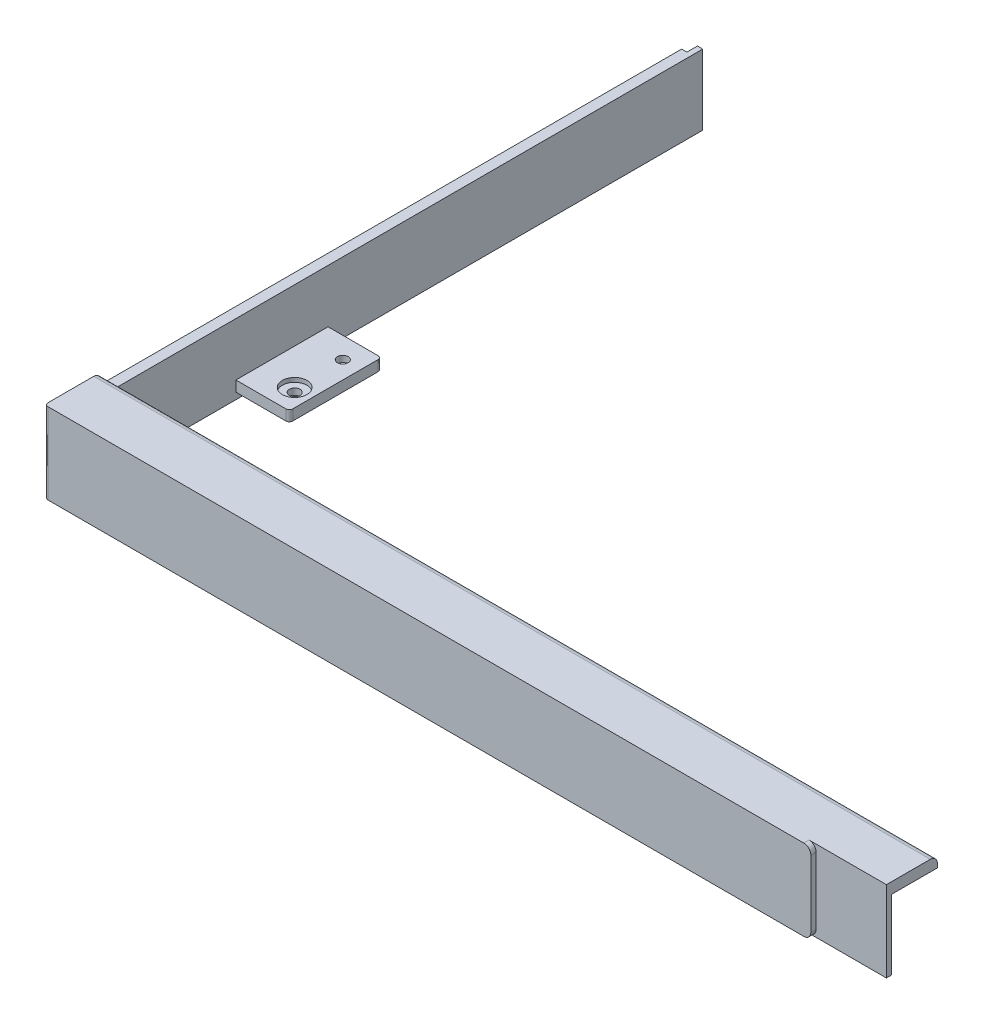
ISO-10303-21;
HEADER;
FILE_DESCRIPTION(('STEP AP214'),'2;1');
FILE_NAME('part.step','',(''),(''),'','','');
FILE_SCHEMA(('AUTOMOTIVE_DESIGN { 1 0 10303 214 1 1 1 1 }'));
ENDSEC;
DATA;
#1=APPLICATION_CONTEXT('core data for automotive mechanical design processes');
#2=APPLICATION_PROTOCOL_DEFINITION('international standard','automotive_design',2000,#1);
#3=PRODUCT_CONTEXT('',#1,'mechanical');
#4=PRODUCT('Part','Part','',(#3));
#5=PRODUCT_RELATED_PRODUCT_CATEGORY('part','',(#4));
#6=PRODUCT_DEFINITION_FORMATION('','',#4);
#7=PRODUCT_DEFINITION_CONTEXT('part definition',#1,'design');
#8=PRODUCT_DEFINITION('design','',#6,#7);
#9=PRODUCT_DEFINITION_SHAPE('','',#8);
#10=(LENGTH_UNIT() NAMED_UNIT(*) SI_UNIT(.MILLI.,.METRE.));
#11=(NAMED_UNIT(*) PLANE_ANGLE_UNIT() SI_UNIT($,.RADIAN.));
#12=(NAMED_UNIT(*) SI_UNIT($,.STERADIAN.) SOLID_ANGLE_UNIT());
#13=UNCERTAINTY_MEASURE_WITH_UNIT(LENGTH_MEASURE(1.E-05),#10,'distance_accuracy_value','');
#14=(GEOMETRIC_REPRESENTATION_CONTEXT(3) GLOBAL_UNCERTAINTY_ASSIGNED_CONTEXT((#13)) GLOBAL_UNIT_ASSIGNED_CONTEXT((#10,
#11,#12)) REPRESENTATION_CONTEXT('',''));
#15=CARTESIAN_POINT('',(0.,0.,0.));
#16=DIRECTION('',(0.,0.,1.));
#17=DIRECTION('',(1.,0.,0.));
#18=AXIS2_PLACEMENT_3D('',#15,#16,#17);
#19=CARTESIAN_POINT('',(-69.4,23.,-3.69999999999995));
#20=DIRECTION('',(-1.,0.,0.));
#21=DIRECTION('',(0.,0.,1.));
#22=AXIS2_PLACEMENT_3D('',#19,#20,#21);
#23=PLANE('',#22);
#24=DIRECTION('',(0.,1.,0.));
#25=VECTOR('',#24,1.);
#26=CARTESIAN_POINT('',(-69.4,0.,179.05));
#27=LINE('',#26,#25);
#28=CARTESIAN_POINT('',(-69.4,0.,179.05));
#29=VERTEX_POINT('',#28);
#30=CARTESIAN_POINT('',(-69.4,23.,179.05));
#31=VERTEX_POINT('',#30);
#32=EDGE_CURVE('E310',#29,#31,#27,.T.);
#33=ORIENTED_EDGE('',*,*,#32,.F.);
#34=DIRECTION('',(0.,0.,1.));
#35=VECTOR('',#34,1.);
#36=CARTESIAN_POINT('',(-69.4,0.,-3.69999999999995));
#37=LINE('',#36,#35);
#38=CARTESIAN_POINT('',(-69.4,0.,177.55));
#39=VERTEX_POINT('',#38);
#40=EDGE_CURVE('E336',#39,#29,#37,.T.);
#41=ORIENTED_EDGE('',*,*,#40,.F.);
#42=DIRECTION('',(0.,1.,0.));
#43=VECTOR('',#42,1.);
#44=CARTESIAN_POINT('',(-69.4,20.,177.55));
#45=LINE('',#44,#43);
#46=CARTESIAN_POINT('',(-69.4,19.8698079090092,177.55));
#47=VERTEX_POINT('',#46);
#48=EDGE_CURVE('E348',#39,#47,#45,.T.);
#49=ORIENTED_EDGE('',*,*,#48,.T.);
#50=DIRECTION('',(0.,0.,-1.));
#51=VECTOR('',#50,1.);
#52=CARTESIAN_POINT('',(-69.4,19.8698079090092,0.));
#53=LINE('',#52,#51);
#54=CARTESIAN_POINT('',(-69.4,19.8698079090092,164.55));
#55=VERTEX_POINT('',#54);
#56=EDGE_CURVE('E340',#47,#55,#53,.T.);
#57=ORIENTED_EDGE('',*,*,#56,.T.);
#58=DIRECTION('',(0.,1.,0.));
#59=VECTOR('',#58,1.);
#60=CARTESIAN_POINT('',(-69.4,19.8698079090092,164.55));
#61=LINE('',#60,#59);
#62=CARTESIAN_POINT('',(-69.4,21.,164.55));
#63=VERTEX_POINT('',#62);
#64=EDGE_CURVE('E335',#55,#63,#61,.T.);
#65=ORIENTED_EDGE('',*,*,#64,.T.);
#66=CARTESIAN_POINT('',(-69.4,21.,166.55));
#67=DIRECTION('',(-1.,0.,0.));
#68=DIRECTION('',(0.,0.,1.));
#69=AXIS2_PLACEMENT_3D('',#66,#67,#68);
#70=CIRCLE('',#69,2.);
#71=CARTESIAN_POINT('',(-69.4,23.,166.55));
#72=VERTEX_POINT('',#71);
#73=EDGE_CURVE('E333',#63,#72,#70,.F.);
#74=ORIENTED_EDGE('',*,*,#73,.T.);
#75=DIRECTION('',(0.,0.,1.));
#76=VECTOR('',#75,1.);
#77=CARTESIAN_POINT('',(-69.4,23.,-3.69999999999995));
#78=LINE('',#77,#76);
#79=EDGE_CURVE('E324',#72,#31,#78,.T.);
#80=ORIENTED_EDGE('',*,*,#79,.T.);
#81=EDGE_LOOP('',(#33,#41,#49,#57,#65,#74,#80));
#82=FACE_BOUND('',#81,.T.);
#83=ADVANCED_FACE('F155',(#82),#23,.F.);
#84=CARTESIAN_POINT('',(0.,23.,0.));
#85=DIRECTION('',(0.,-1.,0.));
#86=DIRECTION('',(0.,0.,-1.));
#87=AXIS2_PLACEMENT_3D('',#84,#85,#86);
#88=PLANE('',#87);
#89=DIRECTION('',(1.,0.,0.));
#90=VECTOR('',#89,1.);
#91=CARTESIAN_POINT('',(-307.4,23.,180.55));
#92=LINE('',#91,#90);
#93=CARTESIAN_POINT('',(-306.4,23.,180.55));
#94=VERTEX_POINT('',#93);
#95=CARTESIAN_POINT('',(-91.4,23.,180.55));
#96=VERTEX_POINT('',#95);
#97=EDGE_CURVE('E446',#94,#96,#92,.T.);
#98=ORIENTED_EDGE('',*,*,#97,.T.);
#99=DIRECTION('',(0.,0.,1.));
#100=VECTOR('',#99,1.);
#101=CARTESIAN_POINT('',(-91.4,23.,0.));
#102=LINE('',#101,#100);
#103=CARTESIAN_POINT('',(-91.4,23.,179.05));
#104=VERTEX_POINT('',#103);
#105=EDGE_CURVE('E327',#96,#104,#102,.F.);
#106=ORIENTED_EDGE('',*,*,#105,.T.);
#107=DIRECTION('',(-1.,0.,0.));
#108=VECTOR('',#107,1.);
#109=CARTESIAN_POINT('',(-69.4,23.,179.05));
#110=LINE('',#109,#108);
#111=EDGE_CURVE('E170',#31,#104,#110,.T.);
#112=ORIENTED_EDGE('',*,*,#111,.F.);
#113=ORIENTED_EDGE('',*,*,#79,.F.);
#114=DIRECTION('',(-1.,0.,0.));
#115=VECTOR('',#114,1.);
#116=CARTESIAN_POINT('',(-307.4,23.,166.55));
#117=LINE('',#116,#115);
#118=CARTESIAN_POINT('',(-307.4,23.,166.55));
#119=VERTEX_POINT('',#118);
#120=EDGE_CURVE('E500',#72,#119,#117,.T.);
#121=ORIENTED_EDGE('',*,*,#120,.T.);
#122=DIRECTION('',(0.,0.,1.));
#123=VECTOR('',#122,1.);
#124=CARTESIAN_POINT('',(-307.4,23.,180.55));
#125=LINE('',#124,#123);
#126=CARTESIAN_POINT('',(-307.4,23.,179.55));
#127=VERTEX_POINT('',#126);
#128=EDGE_CURVE('E442',#119,#127,#125,.T.);
#129=ORIENTED_EDGE('',*,*,#128,.T.);
#130=CARTESIAN_POINT('',(-306.4,23.,179.55));
#131=DIRECTION('',(0.,-1.,0.));
#132=DIRECTION('',(0.,0.,-1.));
#133=AXIS2_PLACEMENT_3D('',#130,#131,#132);
#134=CIRCLE('',#133,1.);
#135=EDGE_CURVE('E529',#127,#94,#134,.F.);
#136=ORIENTED_EDGE('',*,*,#135,.T.);
#137=EDGE_LOOP('',(#98,#106,#112,#113,#121,#129,#136));
#138=FACE_BOUND('',#137,.T.);
#139=ADVANCED_FACE('F323',(#138),#88,.F.);
#140=CARTESIAN_POINT('',(-294.2,1.86980790900918,122.6));
#141=DIRECTION('',(0.,1.,0.));
#142=DIRECTION('',(0.,0.,1.));
#143=AXIS2_PLACEMENT_3D('',#140,#141,#142);
#144=CYLINDRICAL_SURFACE('',#143,1.52499999999998);
#145=CARTESIAN_POINT('',(-294.2,1.86980790900918,122.6));
#146=DIRECTION('',(0.,1.,0.));
#147=DIRECTION('',(0.,0.,1.));
#148=AXIS2_PLACEMENT_3D('',#145,#146,#147);
#149=CIRCLE('',#148,1.52499999999998);
#150=CARTESIAN_POINT('',(-294.2,1.86980790900918,124.125));
#151=VERTEX_POINT('',#150);
#152=EDGE_CURVE('E431',#151,#151,#149,.T.);
#153=ORIENTED_EDGE('',*,*,#152,.F.);
#154=EDGE_LOOP('',(#153));
#155=FACE_BOUND('',#154,.T.);
#156=CARTESIAN_POINT('',(-294.2,3.66980790900918,122.6));
#157=DIRECTION('',(0.,1.,0.));
#158=DIRECTION('',(0.,0.,1.));
#159=AXIS2_PLACEMENT_3D('',#156,#157,#158);
#160=CIRCLE('',#159,1.52499999999998);
#161=CARTESIAN_POINT('',(-294.2,3.66980790900918,124.125));
#162=VERTEX_POINT('',#161);
#163=EDGE_CURVE('E376',#162,#162,#160,.F.);
#164=ORIENTED_EDGE('',*,*,#163,.F.);
#165=EDGE_LOOP('',(#164));
#166=FACE_BOUND('',#165,.T.);
#167=ADVANCED_FACE('F663',(#155,#166),#144,.F.);
#168=CARTESIAN_POINT('',(-294.2,1.86980790900918,108.900000000002));
#169=DIRECTION('',(0.,1.,0.));
#170=DIRECTION('',(0.,0.,1.));
#171=AXIS2_PLACEMENT_3D('',#168,#169,#170);
#172=CYLINDRICAL_SURFACE('',#171,1.52499999999999);
#173=CARTESIAN_POINT('',(-294.2,4.86980790900918,108.900000000002));
#174=DIRECTION('',(0.,1.,0.));
#175=DIRECTION('',(0.,0.,1.));
#176=AXIS2_PLACEMENT_3D('',#173,#174,#175);
#177=CIRCLE('',#176,1.52499999999999);
#178=CARTESIAN_POINT('',(-294.2,4.86980790900918,110.425000000002));
#179=VERTEX_POINT('',#178);
#180=EDGE_CURVE('E414',#179,#179,#177,.T.);
#181=ORIENTED_EDGE('',*,*,#180,.T.);
#182=EDGE_LOOP('',(#181));
#183=FACE_BOUND('',#182,.T.);
#184=CARTESIAN_POINT('',(-294.2,3.06980790900918,108.900000000002));
#185=DIRECTION('',(0.,-1.,0.));
#186=DIRECTION('',(0.,0.,-1.));
#187=AXIS2_PLACEMENT_3D('',#184,#185,#186);
#188=CIRCLE('',#187,1.52499999999999);
#189=CARTESIAN_POINT('',(-294.2,3.06980790900918,107.375000000002));
#190=VERTEX_POINT('',#189);
#191=EDGE_CURVE('E384',#190,#190,#188,.F.);
#192=ORIENTED_EDGE('',*,*,#191,.F.);
#193=EDGE_LOOP('',(#192));
#194=FACE_BOUND('',#193,.T.);
#195=ADVANCED_FACE('F706',(#183,#194),#172,.F.);
#196=CARTESIAN_POINT('',(0.,20.,0.));
#197=DIRECTION('',(0.,1.,0.));
#198=DIRECTION('',(0.,0.,1.));
#199=AXIS2_PLACEMENT_3D('',#196,#197,#198);
#200=PLANE('',#199);
#201=DIRECTION('',(1.,0.,0.));
#202=VECTOR('',#201,1.);
#203=CARTESIAN_POINT('',(0.,20.,-0.699999999999962));
#204=LINE('',#203,#202);
#205=CARTESIAN_POINT('',(-307.4,20.,-0.699999999999962));
#206=VERTEX_POINT('',#205);
#207=CARTESIAN_POINT('',(-305.9,20.,-0.699999999999962));
#208=VERTEX_POINT('',#207);
#209=EDGE_CURVE('E368',#206,#208,#204,.T.);
#210=ORIENTED_EDGE('',*,*,#209,.F.);
#211=DIRECTION('',(0.,0.,1.));
#212=VECTOR('',#211,1.);
#213=CARTESIAN_POINT('',(-307.4,20.,-3.69999999999994));
#214=LINE('',#213,#212);
#215=CARTESIAN_POINT('',(-307.4,20.,164.55));
#216=VERTEX_POINT('',#215);
#217=EDGE_CURVE('E486',#206,#216,#214,.T.);
#218=ORIENTED_EDGE('',*,*,#217,.T.);
#219=DIRECTION('',(-1.,0.,0.));
#220=VECTOR('',#219,1.);
#221=CARTESIAN_POINT('',(0.,20.,164.55));
#222=LINE('',#221,#220);
#223=CARTESIAN_POINT('',(-304.4,20.,164.55));
#224=VERTEX_POINT('',#223);
#225=EDGE_CURVE('E463',#224,#216,#222,.T.);
#226=ORIENTED_EDGE('',*,*,#225,.F.);
#227=DIRECTION('',(0.,0.,1.));
#228=VECTOR('',#227,1.);
#229=CARTESIAN_POINT('',(-304.4,20.,-3.69999999999994));
#230=LINE('',#229,#228);
#231=CARTESIAN_POINT('',(-304.4,20.,-3.69999999999994));
#232=VERTEX_POINT('',#231);
#233=EDGE_CURVE('E468',#232,#224,#230,.T.);
#234=ORIENTED_EDGE('',*,*,#233,.F.);
#235=DIRECTION('',(1.,0.,0.));
#236=VECTOR('',#235,1.);
#237=CARTESIAN_POINT('',(307.4,20.,-3.69999999999996));
#238=LINE('',#237,#236);
#239=CARTESIAN_POINT('',(-305.9,20.,-3.69999999999996));
#240=VERTEX_POINT('',#239);
#241=EDGE_CURVE('E439',#240,#232,#238,.T.);
#242=ORIENTED_EDGE('',*,*,#241,.F.);
#243=DIRECTION('',(0.,0.,-1.));
#244=VECTOR('',#243,1.);
#245=CARTESIAN_POINT('',(-305.9,20.,0.));
#246=LINE('',#245,#244);
#247=EDGE_CURVE('E363',#208,#240,#246,.T.);
#248=ORIENTED_EDGE('',*,*,#247,.F.);
#249=EDGE_LOOP('',(#210,#218,#226,#234,#242,#248));
#250=FACE_BOUND('',#249,.T.);
#251=ADVANCED_FACE('F607',(#250),#200,.T.);
#252=CARTESIAN_POINT('',(0.,0.,0.));
#253=DIRECTION('',(0.,1.,0.));
#254=DIRECTION('',(0.,0.,1.));
#255=AXIS2_PLACEMENT_3D('',#252,#253,#254);
#256=PLANE('',#255);
#257=DIRECTION('',(1.,0.,0.));
#258=VECTOR('',#257,1.);
#259=CARTESIAN_POINT('',(-69.4,0.,179.05));
#260=LINE('',#259,#258);
#261=CARTESIAN_POINT('',(-91.4,0.,179.05));
#262=VERTEX_POINT('',#261);
#263=EDGE_CURVE('E313',#262,#29,#260,.T.);
#264=ORIENTED_EDGE('',*,*,#263,.F.);
#265=DIRECTION('',(0.,0.,1.));
#266=VECTOR('',#265,1.);
#267=CARTESIAN_POINT('',(-91.4,0.,0.));
#268=LINE('',#267,#266);
#269=CARTESIAN_POINT('',(-91.4,0.,180.55));
#270=VERTEX_POINT('',#269);
#271=EDGE_CURVE('E560',#262,#270,#268,.T.);
#272=ORIENTED_EDGE('',*,*,#271,.T.);
#273=DIRECTION('',(1.,0.,0.));
#274=VECTOR('',#273,1.);
#275=CARTESIAN_POINT('',(-304.4,0.,180.55));
#276=LINE('',#275,#274);
#277=CARTESIAN_POINT('',(-306.4,0.,180.55));
#278=VERTEX_POINT('',#277);
#279=EDGE_CURVE('E490',#278,#270,#276,.T.);
#280=ORIENTED_EDGE('',*,*,#279,.F.);
#281=CARTESIAN_POINT('',(-306.4,0.,179.55));
#282=DIRECTION('',(0.,1.,0.));
#283=DIRECTION('',(0.,0.,1.));
#284=AXIS2_PLACEMENT_3D('',#281,#282,#283);
#285=CIRCLE('',#284,1.);
#286=CARTESIAN_POINT('',(-307.4,0.,179.55));
#287=VERTEX_POINT('',#286);
#288=EDGE_CURVE('E523',#278,#287,#285,.F.);
#289=ORIENTED_EDGE('',*,*,#288,.T.);
#290=DIRECTION('',(0.,0.,1.));
#291=VECTOR('',#290,1.);
#292=CARTESIAN_POINT('',(-307.4,0.,-3.69999999999994));
#293=LINE('',#292,#291);
#294=CARTESIAN_POINT('',(-307.4,0.,-0.699999999999962));
#295=VERTEX_POINT('',#294);
#296=EDGE_CURVE('E485',#295,#287,#293,.T.);
#297=ORIENTED_EDGE('',*,*,#296,.F.);
#298=DIRECTION('',(-1.,0.,0.));
#299=VECTOR('',#298,1.);
#300=CARTESIAN_POINT('',(-305.9,0.,-0.699999999999962));
#301=LINE('',#300,#299);
#302=CARTESIAN_POINT('',(-305.9,0.,-0.699999999999962));
#303=VERTEX_POINT('',#302);
#304=EDGE_CURVE('E355',#303,#295,#301,.T.);
#305=ORIENTED_EDGE('',*,*,#304,.F.);
#306=DIRECTION('',(0.,0.,1.));
#307=VECTOR('',#306,1.);
#308=CARTESIAN_POINT('',(-305.9,0.,-3.69999999999996));
#309=LINE('',#308,#307);
#310=CARTESIAN_POINT('',(-305.9,0.,-3.69999999999996));
#311=VERTEX_POINT('',#310);
#312=EDGE_CURVE('E351',#311,#303,#309,.T.);
#313=ORIENTED_EDGE('',*,*,#312,.F.);
#314=DIRECTION('',(-1.,0.,0.));
#315=VECTOR('',#314,1.);
#316=CARTESIAN_POINT('',(307.4,0.,-3.69999999999996));
#317=LINE('',#316,#315);
#318=CARTESIAN_POINT('',(-304.4,0.,-3.69999999999996));
#319=VERTEX_POINT('',#318);
#320=EDGE_CURVE('E435',#319,#311,#317,.T.);
#321=ORIENTED_EDGE('',*,*,#320,.F.);
#322=DIRECTION('',(0.,0.,1.));
#323=VECTOR('',#322,1.);
#324=CARTESIAN_POINT('',(-304.4,0.,-3.69999999999994));
#325=LINE('',#324,#323);
#326=CARTESIAN_POINT('',(-304.4,0.,177.55));
#327=VERTEX_POINT('',#326);
#328=EDGE_CURVE('E467',#319,#327,#325,.T.);
#329=ORIENTED_EDGE('',*,*,#328,.T.);
#330=DIRECTION('',(1.,0.,0.));
#331=VECTOR('',#330,1.);
#332=CARTESIAN_POINT('',(-304.4,0.,177.55));
#333=LINE('',#332,#331);
#334=EDGE_CURVE('E473',#327,#39,#333,.T.);
#335=ORIENTED_EDGE('',*,*,#334,.T.);
#336=ORIENTED_EDGE('',*,*,#40,.T.);
#337=EDGE_LOOP('',(#264,#272,#280,#289,#297,#305,#313,#321,#329,#335,#336));
#338=FACE_BOUND('',#337,.T.);
#339=ADVANCED_FACE('F584',(#338),#256,.F.);
#340=CARTESIAN_POINT('',(-307.4,20.,-3.69999999999994));
#341=DIRECTION('',(1.,0.,0.));
#342=DIRECTION('',(0.,0.,-1.));
#343=AXIS2_PLACEMENT_3D('',#340,#341,#342);
#344=PLANE('',#343);
#345=ORIENTED_EDGE('',*,*,#296,.T.);
#346=DIRECTION('',(0.,-1.,0.));
#347=VECTOR('',#346,1.);
#348=CARTESIAN_POINT('',(-307.4,20.,179.55));
#349=LINE('',#348,#347);
#350=EDGE_CURVE('E526',#287,#127,#349,.F.);
#351=ORIENTED_EDGE('',*,*,#350,.T.);
#352=ORIENTED_EDGE('',*,*,#128,.F.);
#353=CARTESIAN_POINT('',(-307.4,21.,166.55));
#354=DIRECTION('',(1.,0.,0.));
#355=DIRECTION('',(0.,0.,-1.));
#356=AXIS2_PLACEMENT_3D('',#353,#354,#355);
#357=CIRCLE('',#356,2.);
#358=CARTESIAN_POINT('',(-307.4,21.,164.55));
#359=VERTEX_POINT('',#358);
#360=EDGE_CURVE('E503',#119,#359,#357,.F.);
#361=ORIENTED_EDGE('',*,*,#360,.T.);
#362=DIRECTION('',(0.,1.,0.));
#363=VECTOR('',#362,1.);
#364=CARTESIAN_POINT('',(-307.4,19.8698079090092,164.55));
#365=LINE('',#364,#363);
#366=EDGE_CURVE('E452',#216,#359,#365,.T.);
#367=ORIENTED_EDGE('',*,*,#366,.F.);
#368=ORIENTED_EDGE('',*,*,#217,.F.);
#369=DIRECTION('',(0.,-1.,0.));
#370=VECTOR('',#369,1.);
#371=CARTESIAN_POINT('',(-307.4,23.,-0.699999999999962));
#372=LINE('',#371,#370);
#373=EDGE_CURVE('E359',#206,#295,#372,.T.);
#374=ORIENTED_EDGE('',*,*,#373,.T.);
#375=EDGE_LOOP('',(#345,#351,#352,#361,#367,#368,#374));
#376=FACE_BOUND('',#375,.T.);
#377=ADVANCED_FACE('F597',(#376),#344,.F.);
#378=CARTESIAN_POINT('',(-304.4,20.,180.55));
#379=DIRECTION('',(0.,0.,-1.));
#380=DIRECTION('',(-1.,0.,0.));
#381=AXIS2_PLACEMENT_3D('',#378,#379,#380);
#382=PLANE('',#381);
#383=ORIENTED_EDGE('',*,*,#279,.T.);
#384=CARTESIAN_POINT('',(-91.4,2.,180.55));
#385=DIRECTION('',(0.,0.,-1.));
#386=DIRECTION('',(-1.,0.,0.));
#387=AXIS2_PLACEMENT_3D('',#384,#385,#386);
#388=CIRCLE('',#387,2.);
#389=CARTESIAN_POINT('',(-89.4,2.,180.55));
#390=VERTEX_POINT('',#389);
#391=EDGE_CURVE('E567',#270,#390,#388,.F.);
#392=ORIENTED_EDGE('',*,*,#391,.T.);
#393=DIRECTION('',(0.,-1.,0.));
#394=VECTOR('',#393,1.);
#395=CARTESIAN_POINT('',(-89.4,0.,180.55));
#396=LINE('',#395,#394);
#397=CARTESIAN_POINT('',(-89.4,21.,180.55));
#398=VERTEX_POINT('',#397);
#399=EDGE_CURVE('E318',#398,#390,#396,.T.);
#400=ORIENTED_EDGE('',*,*,#399,.F.);
#401=CARTESIAN_POINT('',(-91.4,21.,180.55));
#402=DIRECTION('',(0.,0.,-1.));
#403=DIRECTION('',(-1.,0.,0.));
#404=AXIS2_PLACEMENT_3D('',#401,#402,#403);
#405=CIRCLE('',#404,2.);
#406=EDGE_CURVE('E564',#398,#96,#405,.F.);
#407=ORIENTED_EDGE('',*,*,#406,.T.);
#408=ORIENTED_EDGE('',*,*,#97,.F.);
#409=DIRECTION('',(0.,-1.,0.));
#410=VECTOR('',#409,1.);
#411=CARTESIAN_POINT('',(-306.4,20.,180.55));
#412=LINE('',#411,#410);
#413=EDGE_CURVE('E519',#94,#278,#412,.T.);
#414=ORIENTED_EDGE('',*,*,#413,.T.);
#415=EDGE_LOOP('',(#383,#392,#400,#407,#408,#414));
#416=FACE_BOUND('',#415,.T.);
#417=ADVANCED_FACE('F586',(#416),#382,.F.);
#418=CARTESIAN_POINT('',(-304.4,20.,-3.69999999999994));
#419=DIRECTION('',(1.,0.,0.));
#420=DIRECTION('',(0.,0.,-1.));
#421=AXIS2_PLACEMENT_3D('',#418,#419,#420);
#422=PLANE('',#421);
#423=DIRECTION('',(0.,0.,1.));
#424=VECTOR('',#423,1.);
#425=CARTESIAN_POINT('',(-304.4,1.86980790900918,102.900000000002));
#426=LINE('',#425,#424);
#427=CARTESIAN_POINT('',(-304.4,1.86980790900918,102.900000000002));
#428=VERTEX_POINT('',#427);
#429=CARTESIAN_POINT('',(-304.4,1.86980790900918,129.11856990429));
#430=VERTEX_POINT('',#429);
#431=EDGE_CURVE('E397',#428,#430,#426,.T.);
#432=ORIENTED_EDGE('',*,*,#431,.T.);
#433=DIRECTION('',(0.,1.,0.));
#434=VECTOR('',#433,1.);
#435=CARTESIAN_POINT('',(-304.4,1.86980790900918,129.11856990429));
#436=LINE('',#435,#434);
#437=CARTESIAN_POINT('',(-304.4,4.86980790900918,129.11856990429));
#438=VERTEX_POINT('',#437);
#439=EDGE_CURVE('E389',#430,#438,#436,.T.);
#440=ORIENTED_EDGE('',*,*,#439,.T.);
#441=DIRECTION('',(0.,0.,1.));
#442=VECTOR('',#441,1.);
#443=CARTESIAN_POINT('',(-304.4,4.86980790900918,102.900000000002));
#444=LINE('',#443,#442);
#445=CARTESIAN_POINT('',(-304.4,4.86980790900918,102.9));
#446=VERTEX_POINT('',#445);
#447=EDGE_CURVE('E398',#446,#438,#444,.T.);
#448=ORIENTED_EDGE('',*,*,#447,.F.);
#449=DIRECTION('',(0.,1.,0.));
#450=VECTOR('',#449,1.);
#451=CARTESIAN_POINT('',(-304.4,1.86980790900918,102.900000000002));
#452=LINE('',#451,#450);
#453=EDGE_CURVE('E393',#428,#446,#452,.T.);
#454=ORIENTED_EDGE('',*,*,#453,.F.);
#455=EDGE_LOOP('',(#432,#440,#448,#454));
#456=FACE_BOUND('',#455,.T.);
#457=DIRECTION('',(0.,1.,0.));
#458=VECTOR('',#457,1.);
#459=CARTESIAN_POINT('',(-304.4,20.,164.55));
#460=LINE('',#459,#458);
#461=CARTESIAN_POINT('',(-304.4,19.8698079090092,164.55));
#462=VERTEX_POINT('',#461);
#463=EDGE_CURVE('E489',#462,#224,#460,.T.);
#464=ORIENTED_EDGE('',*,*,#463,.F.);
#465=DIRECTION('',(0.,0.,-1.));
#466=VECTOR('',#465,1.);
#467=CARTESIAN_POINT('',(-304.4,19.8698079090092,-3.69999999999994));
#468=LINE('',#467,#466);
#469=CARTESIAN_POINT('',(-304.4,19.8698079090092,177.55));
#470=VERTEX_POINT('',#469);
#471=EDGE_CURVE('E459',#470,#462,#468,.T.);
#472=ORIENTED_EDGE('',*,*,#471,.F.);
#473=DIRECTION('',(0.,-1.,0.));
#474=VECTOR('',#473,1.);
#475=CARTESIAN_POINT('',(-304.4,20.,177.55));
#476=LINE('',#475,#474);
#477=EDGE_CURVE('E472',#470,#327,#476,.T.);
#478=ORIENTED_EDGE('',*,*,#477,.T.);
#479=ORIENTED_EDGE('',*,*,#328,.F.);
#480=DIRECTION('',(0.,-1.,0.));
#481=VECTOR('',#480,1.);
#482=CARTESIAN_POINT('',(-304.4,20.,-3.69999999999994));
#483=LINE('',#482,#481);
#484=EDGE_CURVE('E482',#232,#319,#483,.T.);
#485=ORIENTED_EDGE('',*,*,#484,.F.);
#486=ORIENTED_EDGE('',*,*,#233,.T.);
#487=EDGE_LOOP('',(#464,#472,#478,#479,#485,#486));
#488=FACE_BOUND('',#487,.T.);
#489=ADVANCED_FACE('F621',(#456,#488),#422,.T.);
#490=CARTESIAN_POINT('',(-304.4,20.,177.55));
#491=DIRECTION('',(0.,0.,-1.));
#492=DIRECTION('',(-1.,0.,0.));
#493=AXIS2_PLACEMENT_3D('',#490,#491,#492);
#494=PLANE('',#493);
#495=ORIENTED_EDGE('',*,*,#48,.F.);
#496=ORIENTED_EDGE('',*,*,#334,.F.);
#497=ORIENTED_EDGE('',*,*,#477,.F.);
#498=DIRECTION('',(-1.,0.,0.));
#499=VECTOR('',#498,1.);
#500=CARTESIAN_POINT('',(-304.4,19.8698079090092,177.55));
#501=LINE('',#500,#499);
#502=EDGE_CURVE('E456',#47,#470,#501,.T.);
#503=ORIENTED_EDGE('',*,*,#502,.F.);
#504=EDGE_LOOP('',(#495,#496,#497,#503));
#505=FACE_BOUND('',#504,.T.);
#506=ADVANCED_FACE('F628',(#505),#494,.T.);
#507=CARTESIAN_POINT('',(-307.4,19.8698079090092,164.55));
#508=DIRECTION('',(0.,0.,-1.));
#509=DIRECTION('',(-1.,0.,0.));
#510=AXIS2_PLACEMENT_3D('',#507,#508,#509);
#511=PLANE('',#510);
#512=ORIENTED_EDGE('',*,*,#64,.F.);
#513=DIRECTION('',(-1.,0.,0.));
#514=VECTOR('',#513,1.);
#515=CARTESIAN_POINT('',(-307.4,19.8698079090092,164.55));
#516=LINE('',#515,#514);
#517=EDGE_CURVE('E449',#55,#462,#516,.T.);
#518=ORIENTED_EDGE('',*,*,#517,.T.);
#519=ORIENTED_EDGE('',*,*,#463,.T.);
#520=ORIENTED_EDGE('',*,*,#225,.T.);
#521=ORIENTED_EDGE('',*,*,#366,.T.);
#522=DIRECTION('',(-1.,0.,0.));
#523=VECTOR('',#522,1.);
#524=CARTESIAN_POINT('',(307.4,21.,164.55));
#525=LINE('',#524,#523);
#526=EDGE_CURVE('E506',#359,#63,#525,.F.);
#527=ORIENTED_EDGE('',*,*,#526,.T.);
#528=EDGE_LOOP('',(#512,#518,#519,#520,#521,#527));
#529=FACE_BOUND('',#528,.T.);
#530=ADVANCED_FACE('F635',(#529),#511,.T.);
#531=CARTESIAN_POINT('',(0.,19.8698079090092,0.));
#532=DIRECTION('',(0.,-1.,0.));
#533=DIRECTION('',(0.,0.,-1.));
#534=AXIS2_PLACEMENT_3D('',#531,#532,#533);
#535=PLANE('',#534);
#536=ORIENTED_EDGE('',*,*,#56,.F.);
#537=ORIENTED_EDGE('',*,*,#502,.T.);
#538=ORIENTED_EDGE('',*,*,#471,.T.);
#539=ORIENTED_EDGE('',*,*,#517,.F.);
#540=EDGE_LOOP('',(#536,#537,#538,#539));
#541=FACE_BOUND('',#540,.T.);
#542=ADVANCED_FACE('F633',(#541),#535,.T.);
#543=CARTESIAN_POINT('',(0.,21.,166.55));
#544=DIRECTION('',(1.,0.,0.));
#545=DIRECTION('',(0.,0.,-1.));
#546=AXIS2_PLACEMENT_3D('',#543,#544,#545);
#547=CYLINDRICAL_SURFACE('',#546,2.);
#548=ORIENTED_EDGE('',*,*,#73,.F.);
#549=ORIENTED_EDGE('',*,*,#526,.F.);
#550=ORIENTED_EDGE('',*,*,#360,.F.);
#551=ORIENTED_EDGE('',*,*,#120,.F.);
#552=EDGE_LOOP('',(#548,#549,#550,#551));
#553=FACE_BOUND('',#552,.T.);
#554=ADVANCED_FACE('F639',(#553),#547,.T.);
#555=CARTESIAN_POINT('',(0.,0.,-3.69999999999996));
#556=DIRECTION('',(0.,0.,-1.));
#557=DIRECTION('',(-1.,0.,0.));
#558=AXIS2_PLACEMENT_3D('',#555,#556,#557);
#559=PLANE('',#558);
#560=DIRECTION('',(0.,-1.,0.));
#561=VECTOR('',#560,1.);
#562=CARTESIAN_POINT('',(-305.9,0.,-3.69999999999996));
#563=LINE('',#562,#561);
#564=EDGE_CURVE('E510',#240,#311,#563,.T.);
#565=ORIENTED_EDGE('',*,*,#564,.F.);
#566=ORIENTED_EDGE('',*,*,#241,.T.);
#567=ORIENTED_EDGE('',*,*,#484,.T.);
#568=ORIENTED_EDGE('',*,*,#320,.T.);
#569=EDGE_LOOP('',(#565,#566,#567,#568));
#570=FACE_BOUND('',#569,.T.);
#571=ADVANCED_FACE('F615',(#570),#559,.T.);
#572=CARTESIAN_POINT('',(-304.4,1.86980790900918,102.900000000002));
#573=DIRECTION('',(1.12300519760601E-13,0.,1.));
#574=DIRECTION('',(1.,0.,-1.12300519760601E-13));
#575=AXIS2_PLACEMENT_3D('',#572,#573,#574);
#576=PLANE('',#575);
#577=DIRECTION('',(1.,0.,-1.12300519760601E-13));
#578=VECTOR('',#577,1.);
#579=CARTESIAN_POINT('',(-304.4,4.86980790900918,102.900000000002));
#580=LINE('',#579,#578);
#581=CARTESIAN_POINT('',(-290.2,4.86980790900918,102.9));
#582=VERTEX_POINT('',#581);
#583=EDGE_CURVE('E410',#446,#582,#580,.T.);
#584=ORIENTED_EDGE('',*,*,#583,.T.);
#585=DIRECTION('',(0.,1.,0.));
#586=VECTOR('',#585,1.);
#587=CARTESIAN_POINT('',(-290.2,1.86980790900918,102.9));
#588=LINE('',#587,#586);
#589=CARTESIAN_POINT('',(-290.2,1.86980790900918,102.9));
#590=VERTEX_POINT('',#589);
#591=EDGE_CURVE('E555',#582,#590,#588,.F.);
#592=ORIENTED_EDGE('',*,*,#591,.T.);
#593=DIRECTION('',(1.,0.,-1.12300519760601E-13));
#594=VECTOR('',#593,1.);
#595=CARTESIAN_POINT('',(-304.4,1.86980790900918,102.900000000002));
#596=LINE('',#595,#594);
#597=EDGE_CURVE('E403',#428,#590,#596,.T.);
#598=ORIENTED_EDGE('',*,*,#597,.F.);
#599=ORIENTED_EDGE('',*,*,#453,.T.);
#600=EDGE_LOOP('',(#584,#592,#598,#599));
#601=FACE_BOUND('',#600,.T.);
#602=ADVANCED_FACE('F687',(#601),#576,.F.);
#603=CARTESIAN_POINT('',(-289.2,1.86980790900918,102.9));
#604=DIRECTION('',(-1.,0.,0.));
#605=DIRECTION('',(0.,0.,1.));
#606=AXIS2_PLACEMENT_3D('',#603,#604,#605);
#607=PLANE('',#606);
#608=DIRECTION('',(0.,0.,1.));
#609=VECTOR('',#608,1.);
#610=CARTESIAN_POINT('',(-289.2,4.86980790900918,102.9));
#611=LINE('',#610,#609);
#612=CARTESIAN_POINT('',(-289.2,4.86980790900918,103.9));
#613=VERTEX_POINT('',#612);
#614=CARTESIAN_POINT('',(-289.2,4.86980790900918,128.11856990429));
#615=VERTEX_POINT('',#614);
#616=EDGE_CURVE('E406',#613,#615,#611,.T.);
#617=ORIENTED_EDGE('',*,*,#616,.T.);
#618=DIRECTION('',(0.,1.,0.));
#619=VECTOR('',#618,1.);
#620=CARTESIAN_POINT('',(-289.2,1.86980790900918,128.11856990429));
#621=LINE('',#620,#619);
#622=CARTESIAN_POINT('',(-289.2,1.86980790900918,128.11856990429));
#623=VERTEX_POINT('',#622);
#624=EDGE_CURVE('E546',#615,#623,#621,.F.);
#625=ORIENTED_EDGE('',*,*,#624,.T.);
#626=DIRECTION('',(0.,0.,1.));
#627=VECTOR('',#626,1.);
#628=CARTESIAN_POINT('',(-289.2,1.86980790900918,102.9));
#629=LINE('',#628,#627);
#630=CARTESIAN_POINT('',(-289.2,1.86980790900918,103.9));
#631=VERTEX_POINT('',#630);
#632=EDGE_CURVE('E421',#631,#623,#629,.T.);
#633=ORIENTED_EDGE('',*,*,#632,.F.);
#634=DIRECTION('',(0.,1.,0.));
#635=VECTOR('',#634,1.);
#636=CARTESIAN_POINT('',(-289.2,1.86980790900918,103.9));
#637=LINE('',#636,#635);
#638=EDGE_CURVE('E542',#631,#613,#637,.T.);
#639=ORIENTED_EDGE('',*,*,#638,.T.);
#640=EDGE_LOOP('',(#617,#625,#633,#639));
#641=FACE_BOUND('',#640,.T.);
#642=ADVANCED_FACE('F690',(#641),#607,.F.);
#643=CARTESIAN_POINT('',(-289.2,1.86980790900918,129.11856990429));
#644=DIRECTION('',(0.,0.,-1.));
#645=DIRECTION('',(-1.,0.,0.));
#646=AXIS2_PLACEMENT_3D('',#643,#644,#645);
#647=PLANE('',#646);
#648=DIRECTION('',(-1.,0.,0.));
#649=VECTOR('',#648,1.);
#650=CARTESIAN_POINT('',(-289.2,1.86980790900918,129.11856990429));
#651=LINE('',#650,#649);
#652=CARTESIAN_POINT('',(-290.2,1.86980790900918,129.11856990429));
#653=VERTEX_POINT('',#652);
#654=EDGE_CURVE('E418',#653,#430,#651,.T.);
#655=ORIENTED_EDGE('',*,*,#654,.F.);
#656=DIRECTION('',(0.,1.,0.));
#657=VECTOR('',#656,1.);
#658=CARTESIAN_POINT('',(-290.2,1.86980790900918,129.11856990429));
#659=LINE('',#658,#657);
#660=CARTESIAN_POINT('',(-290.2,4.86980790900918,129.11856990429));
#661=VERTEX_POINT('',#660);
#662=EDGE_CURVE('E532',#653,#661,#659,.T.);
#663=ORIENTED_EDGE('',*,*,#662,.T.);
#664=DIRECTION('',(-1.,0.,0.));
#665=VECTOR('',#664,1.);
#666=CARTESIAN_POINT('',(-289.2,4.86980790900918,129.11856990429));
#667=LINE('',#666,#665);
#668=EDGE_CURVE('E402',#661,#438,#667,.T.);
#669=ORIENTED_EDGE('',*,*,#668,.T.);
#670=ORIENTED_EDGE('',*,*,#439,.F.);
#671=EDGE_LOOP('',(#655,#663,#669,#670));
#672=FACE_BOUND('',#671,.T.);
#673=ADVANCED_FACE('F694',(#672),#647,.F.);
#674=CARTESIAN_POINT('',(0.,1.86980790900918,0.));
#675=DIRECTION('',(0.,-1.,0.));
#676=DIRECTION('',(0.,0.,-1.));
#677=AXIS2_PLACEMENT_3D('',#674,#675,#676);
#678=PLANE('',#677);
#679=CARTESIAN_POINT('',(-294.2,1.86980790900918,108.9));
#680=DIRECTION('',(0.,-1.,0.));
#681=DIRECTION('',(0.,0.,-1.));
#682=AXIS2_PLACEMENT_3D('',#679,#680,#681);
#683=CIRCLE('',#682,3.50000000000002);
#684=CARTESIAN_POINT('',(-294.2,1.86980790900918,105.4));
#685=VERTEX_POINT('',#684);
#686=EDGE_CURVE('E380',#685,#685,#683,.T.);
#687=ORIENTED_EDGE('',*,*,#686,.F.);
#688=EDGE_LOOP('',(#687));
#689=FACE_BOUND('',#688,.T.);
#690=ORIENTED_EDGE('',*,*,#152,.T.);
#691=EDGE_LOOP('',(#690));
#692=FACE_BOUND('',#691,.T.);
#693=ORIENTED_EDGE('',*,*,#632,.T.);
#694=CARTESIAN_POINT('',(-290.2,1.86980790900918,128.11856990429));
#695=DIRECTION('',(0.,-1.,0.));
#696=DIRECTION('',(0.,0.,-1.));
#697=AXIS2_PLACEMENT_3D('',#694,#695,#696);
#698=CIRCLE('',#697,1.);
#699=EDGE_CURVE('E552',#623,#653,#698,.T.);
#700=ORIENTED_EDGE('',*,*,#699,.T.);
#701=ORIENTED_EDGE('',*,*,#654,.T.);
#702=ORIENTED_EDGE('',*,*,#431,.F.);
#703=ORIENTED_EDGE('',*,*,#597,.T.);
#704=CARTESIAN_POINT('',(-290.2,1.86980790900918,103.9));
#705=DIRECTION('',(0.,-1.,0.));
#706=DIRECTION('',(0.,0.,-1.));
#707=AXIS2_PLACEMENT_3D('',#704,#705,#706);
#708=CIRCLE('',#707,1.);
#709=EDGE_CURVE('E549',#590,#631,#708,.T.);
#710=ORIENTED_EDGE('',*,*,#709,.T.);
#711=EDGE_LOOP('',(#693,#700,#701,#702,#703,#710));
#712=FACE_BOUND('',#711,.T.);
#713=ADVANCED_FACE('F698',(#689,#692,#712),#678,.T.);
#714=CARTESIAN_POINT('',(0.,4.86980790900918,0.));
#715=DIRECTION('',(0.,-1.,0.));
#716=DIRECTION('',(0.,0.,-1.));
#717=AXIS2_PLACEMENT_3D('',#714,#715,#716);
#718=PLANE('',#717);
#719=CARTESIAN_POINT('',(-294.2,4.86980790900918,122.6));
#720=DIRECTION('',(0.,1.,0.));
#721=DIRECTION('',(0.,0.,1.));
#722=AXIS2_PLACEMENT_3D('',#719,#720,#721);
#723=CIRCLE('',#722,3.50000000000002);
#724=CARTESIAN_POINT('',(-294.2,4.86980790900918,126.1));
#725=VERTEX_POINT('',#724);
#726=EDGE_CURVE('E372',#725,#725,#723,.T.);
#727=ORIENTED_EDGE('',*,*,#726,.F.);
#728=EDGE_LOOP('',(#727));
#729=FACE_BOUND('',#728,.T.);
#730=ORIENTED_EDGE('',*,*,#180,.F.);
#731=EDGE_LOOP('',(#730));
#732=FACE_BOUND('',#731,.T.);
#733=ORIENTED_EDGE('',*,*,#668,.F.);
#734=CARTESIAN_POINT('',(-290.2,4.86980790900918,128.11856990429));
#735=DIRECTION('',(0.,-1.,0.));
#736=DIRECTION('',(0.,0.,-1.));
#737=AXIS2_PLACEMENT_3D('',#734,#735,#736);
#738=CIRCLE('',#737,1.);
#739=EDGE_CURVE('E539',#661,#615,#738,.F.);
#740=ORIENTED_EDGE('',*,*,#739,.T.);
#741=ORIENTED_EDGE('',*,*,#616,.F.);
#742=CARTESIAN_POINT('',(-290.2,4.86980790900918,103.9));
#743=DIRECTION('',(0.,-1.,0.));
#744=DIRECTION('',(0.,0.,-1.));
#745=AXIS2_PLACEMENT_3D('',#742,#743,#744);
#746=CIRCLE('',#745,1.);
#747=EDGE_CURVE('E536',#613,#582,#746,.F.);
#748=ORIENTED_EDGE('',*,*,#747,.T.);
#749=ORIENTED_EDGE('',*,*,#583,.F.);
#750=ORIENTED_EDGE('',*,*,#447,.T.);
#751=EDGE_LOOP('',(#733,#740,#741,#748,#749,#750));
#752=FACE_BOUND('',#751,.T.);
#753=ADVANCED_FACE('F685',(#729,#732,#752),#718,.F.);
#754=CARTESIAN_POINT('',(-294.2,3.06980790900918,108.9));
#755=DIRECTION('',(0.,-1.,0.));
#756=DIRECTION('',(0.,0.,-1.));
#757=AXIS2_PLACEMENT_3D('',#754,#755,#756);
#758=PLANE('',#757);
#759=CARTESIAN_POINT('',(-294.2,3.06980790900918,108.9));
#760=DIRECTION('',(0.,-1.,0.));
#761=DIRECTION('',(0.,0.,-1.));
#762=AXIS2_PLACEMENT_3D('',#759,#760,#761);
#763=CIRCLE('',#762,3.50000000000002);
#764=CARTESIAN_POINT('',(-294.2,3.06980790900918,105.4));
#765=VERTEX_POINT('',#764);
#766=EDGE_CURVE('E385',#765,#765,#763,.T.);
#767=ORIENTED_EDGE('',*,*,#766,.T.);
#768=EDGE_LOOP('',(#767));
#769=FACE_BOUND('',#768,.T.);
#770=ORIENTED_EDGE('',*,*,#191,.T.);
#771=EDGE_LOOP('',(#770));
#772=FACE_BOUND('',#771,.T.);
#773=ADVANCED_FACE('F681',(#769,#772),#758,.T.);
#774=CARTESIAN_POINT('',(-294.2,3.06980790900918,108.9));
#775=DIRECTION('',(0.,-1.,0.));
#776=DIRECTION('',(0.,0.,-1.));
#777=AXIS2_PLACEMENT_3D('',#774,#775,#776);
#778=CYLINDRICAL_SURFACE('',#777,3.50000000000002);
#779=ORIENTED_EDGE('',*,*,#766,.F.);
#780=EDGE_LOOP('',(#779));
#781=FACE_BOUND('',#780,.T.);
#782=ORIENTED_EDGE('',*,*,#686,.T.);
#783=EDGE_LOOP('',(#782));
#784=FACE_BOUND('',#783,.T.);
#785=ADVANCED_FACE('F677',(#781,#784),#778,.F.);
#786=CARTESIAN_POINT('',(-294.2,3.66980790900918,122.6));
#787=DIRECTION('',(0.,1.,0.));
#788=DIRECTION('',(0.,0.,1.));
#789=AXIS2_PLACEMENT_3D('',#786,#787,#788);
#790=PLANE('',#789);
#791=CARTESIAN_POINT('',(-294.2,3.66980790900918,122.6));
#792=DIRECTION('',(0.,1.,0.));
#793=DIRECTION('',(0.,0.,1.));
#794=AXIS2_PLACEMENT_3D('',#791,#792,#793);
#795=CIRCLE('',#794,3.50000000000002);
#796=CARTESIAN_POINT('',(-294.2,3.66980790900918,126.1));
#797=VERTEX_POINT('',#796);
#798=EDGE_CURVE('E371',#797,#797,#795,.T.);
#799=ORIENTED_EDGE('',*,*,#798,.T.);
#800=EDGE_LOOP('',(#799));
#801=FACE_BOUND('',#800,.T.);
#802=ORIENTED_EDGE('',*,*,#163,.T.);
#803=EDGE_LOOP('',(#802));
#804=FACE_BOUND('',#803,.T.);
#805=ADVANCED_FACE('F673',(#801,#804),#790,.T.);
#806=CARTESIAN_POINT('',(-294.2,3.66980790900918,122.6));
#807=DIRECTION('',(0.,1.,0.));
#808=DIRECTION('',(0.,0.,1.));
#809=AXIS2_PLACEMENT_3D('',#806,#807,#808);
#810=CYLINDRICAL_SURFACE('',#809,3.50000000000002);
#811=ORIENTED_EDGE('',*,*,#798,.F.);
#812=EDGE_LOOP('',(#811));
#813=FACE_BOUND('',#812,.T.);
#814=ORIENTED_EDGE('',*,*,#726,.T.);
#815=EDGE_LOOP('',(#814));
#816=FACE_BOUND('',#815,.T.);
#817=ADVANCED_FACE('F668',(#813,#816),#810,.F.);
#818=CARTESIAN_POINT('',(-305.9,23.,-0.699999999999962));
#819=DIRECTION('',(0.,0.,1.));
#820=DIRECTION('',(1.,0.,0.));
#821=AXIS2_PLACEMENT_3D('',#818,#819,#820);
#822=PLANE('',#821);
#823=ORIENTED_EDGE('',*,*,#209,.T.);
#824=DIRECTION('',(0.,-1.,0.));
#825=VECTOR('',#824,1.);
#826=CARTESIAN_POINT('',(-305.9,23.,-0.699999999999962));
#827=LINE('',#826,#825);
#828=EDGE_CURVE('E358',#208,#303,#827,.T.);
#829=ORIENTED_EDGE('',*,*,#828,.T.);
#830=ORIENTED_EDGE('',*,*,#304,.T.);
#831=ORIENTED_EDGE('',*,*,#373,.F.);
#832=EDGE_LOOP('',(#823,#829,#830,#831));
#833=FACE_BOUND('',#832,.T.);
#834=ADVANCED_FACE('F603',(#833),#822,.F.);
#835=CARTESIAN_POINT('',(-305.9,23.,-3.69999999999996));
#836=DIRECTION('',(1.,0.,0.));
#837=DIRECTION('',(0.,0.,-1.));
#838=AXIS2_PLACEMENT_3D('',#835,#836,#837);
#839=PLANE('',#838);
#840=ORIENTED_EDGE('',*,*,#247,.T.);
#841=ORIENTED_EDGE('',*,*,#564,.T.);
#842=ORIENTED_EDGE('',*,*,#312,.T.);
#843=ORIENTED_EDGE('',*,*,#828,.F.);
#844=EDGE_LOOP('',(#840,#841,#842,#843));
#845=FACE_BOUND('',#844,.T.);
#846=ADVANCED_FACE('F612',(#845),#839,.F.);
#847=CARTESIAN_POINT('',(-306.4,20.,179.55));
#848=DIRECTION('',(0.,-1.,0.));
#849=DIRECTION('',(0.,0.,-1.));
#850=AXIS2_PLACEMENT_3D('',#847,#848,#849);
#851=CYLINDRICAL_SURFACE('',#850,1.);
#852=ORIENTED_EDGE('',*,*,#135,.F.);
#853=ORIENTED_EDGE('',*,*,#350,.F.);
#854=ORIENTED_EDGE('',*,*,#288,.F.);
#855=ORIENTED_EDGE('',*,*,#413,.F.);
#856=EDGE_LOOP('',(#852,#853,#854,#855));
#857=FACE_BOUND('',#856,.T.);
#858=ADVANCED_FACE('F592',(#857),#851,.T.);
#859=CARTESIAN_POINT('',(-290.2,1.86980790900918,128.11856990429));
#860=DIRECTION('',(0.,1.,0.));
#861=DIRECTION('',(0.,0.,1.));
#862=AXIS2_PLACEMENT_3D('',#859,#860,#861);
#863=CYLINDRICAL_SURFACE('',#862,1.);
#864=ORIENTED_EDGE('',*,*,#699,.F.);
#865=ORIENTED_EDGE('',*,*,#624,.F.);
#866=ORIENTED_EDGE('',*,*,#739,.F.);
#867=ORIENTED_EDGE('',*,*,#662,.F.);
#868=EDGE_LOOP('',(#864,#865,#866,#867));
#869=FACE_BOUND('',#868,.T.);
#870=ADVANCED_FACE('F655',(#869),#863,.T.);
#871=CARTESIAN_POINT('',(-290.2,1.86980790900918,103.9));
#872=DIRECTION('',(0.,1.,0.));
#873=DIRECTION('',(0.,0.,1.));
#874=AXIS2_PLACEMENT_3D('',#871,#872,#873);
#875=CYLINDRICAL_SURFACE('',#874,1.);
#876=ORIENTED_EDGE('',*,*,#709,.F.);
#877=ORIENTED_EDGE('',*,*,#591,.F.);
#878=ORIENTED_EDGE('',*,*,#747,.F.);
#879=ORIENTED_EDGE('',*,*,#638,.F.);
#880=EDGE_LOOP('',(#876,#877,#878,#879));
#881=FACE_BOUND('',#880,.T.);
#882=ADVANCED_FACE('F648',(#881),#875,.T.);
#883=CARTESIAN_POINT('',(-89.4,0.,179.05));
#884=DIRECTION('',(-1.,0.,0.));
#885=DIRECTION('',(0.,-1.,0.));
#886=AXIS2_PLACEMENT_3D('',#883,#884,#885);
#887=PLANE('',#886);
#888=ORIENTED_EDGE('',*,*,#399,.T.);
#889=DIRECTION('',(0.,0.,1.));
#890=VECTOR('',#889,1.);
#891=CARTESIAN_POINT('',(-89.4,2.,179.05));
#892=LINE('',#891,#890);
#893=CARTESIAN_POINT('',(-89.4,2.,179.05));
#894=VERTEX_POINT('',#893);
#895=EDGE_CURVE('E178',#390,#894,#892,.F.);
#896=ORIENTED_EDGE('',*,*,#895,.T.);
#897=DIRECTION('',(0.,-1.,0.));
#898=VECTOR('',#897,1.);
#899=CARTESIAN_POINT('',(-89.4,0.,179.05));
#900=LINE('',#899,#898);
#901=CARTESIAN_POINT('',(-89.4,21.,179.05));
#902=VERTEX_POINT('',#901);
#903=EDGE_CURVE('E330',#902,#894,#900,.T.);
#904=ORIENTED_EDGE('',*,*,#903,.F.);
#905=DIRECTION('',(0.,0.,1.));
#906=VECTOR('',#905,1.);
#907=CARTESIAN_POINT('',(-89.4,21.,179.05));
#908=LINE('',#907,#906);
#909=EDGE_CURVE('E570',#902,#398,#908,.T.);
#910=ORIENTED_EDGE('',*,*,#909,.T.);
#911=EDGE_LOOP('',(#888,#896,#904,#910));
#912=FACE_BOUND('',#911,.T.);
#913=ADVANCED_FACE('F642',(#912),#887,.F.);
#914=CARTESIAN_POINT('',(0.,0.,179.05));
#915=DIRECTION('',(0.,0.,1.));
#916=DIRECTION('',(1.,0.,0.));
#917=AXIS2_PLACEMENT_3D('',#914,#915,#916);
#918=PLANE('',#917);
#919=ORIENTED_EDGE('',*,*,#32,.T.);
#920=ORIENTED_EDGE('',*,*,#111,.T.);
#921=CARTESIAN_POINT('',(-91.4,21.,179.05));
#922=DIRECTION('',(0.,0.,1.));
#923=DIRECTION('',(1.,0.,0.));
#924=AXIS2_PLACEMENT_3D('',#921,#922,#923);
#925=CIRCLE('',#924,2.);
#926=EDGE_CURVE('E12',#104,#902,#925,.F.);
#927=ORIENTED_EDGE('',*,*,#926,.T.);
#928=ORIENTED_EDGE('',*,*,#903,.T.);
#929=CARTESIAN_POINT('',(-91.4,2.,179.05));
#930=DIRECTION('',(0.,0.,1.));
#931=DIRECTION('',(1.,0.,0.));
#932=AXIS2_PLACEMENT_3D('',#929,#930,#931);
#933=CIRCLE('',#932,2.);
#934=EDGE_CURVE('E164',#894,#262,#933,.F.);
#935=ORIENTED_EDGE('',*,*,#934,.T.);
#936=ORIENTED_EDGE('',*,*,#263,.T.);
#937=EDGE_LOOP('',(#919,#920,#927,#928,#935,#936));
#938=FACE_BOUND('',#937,.T.);
#939=ADVANCED_FACE('F311',(#938),#918,.T.);
#940=CARTESIAN_POINT('',(-91.4,2.,0.));
#941=DIRECTION('',(0.,0.,1.));
#942=DIRECTION('',(1.,0.,0.));
#943=AXIS2_PLACEMENT_3D('',#940,#941,#942);
#944=CYLINDRICAL_SURFACE('',#943,2.);
#945=ORIENTED_EDGE('',*,*,#934,.F.);
#946=ORIENTED_EDGE('',*,*,#895,.F.);
#947=ORIENTED_EDGE('',*,*,#391,.F.);
#948=ORIENTED_EDGE('',*,*,#271,.F.);
#949=EDGE_LOOP('',(#945,#946,#947,#948));
#950=FACE_BOUND('',#949,.T.);
#951=ADVANCED_FACE('F581',(#950),#944,.T.);
#952=CARTESIAN_POINT('',(-91.4,21.,179.05));
#953=DIRECTION('',(0.,0.,1.));
#954=DIRECTION('',(1.,0.,0.));
#955=AXIS2_PLACEMENT_3D('',#952,#953,#954);
#956=CYLINDRICAL_SURFACE('',#955,2.);
#957=ORIENTED_EDGE('',*,*,#926,.F.);
#958=ORIENTED_EDGE('',*,*,#105,.F.);
#959=ORIENTED_EDGE('',*,*,#406,.F.);
#960=ORIENTED_EDGE('',*,*,#909,.F.);
#961=EDGE_LOOP('',(#957,#958,#959,#960));
#962=FACE_BOUND('',#961,.T.);
#963=ADVANCED_FACE('F157',(#962),#956,.T.);
#964=CLOSED_SHELL('',(#83,#139,#167,#195,#251,#339,#377,#417,#489,#506,#530,#542,#554,#571,#602,
#642,#673,#713,#753,#773,#785,#805,#817,#834,#846,#858,#870,#882,#913,#939,#951,#963));
#965=MANIFOLD_SOLID_BREP('B2',#964);
#966=ADVANCED_BREP_SHAPE_REPRESENTATION('',(#18,#965),#14);
#967=SHAPE_DEFINITION_REPRESENTATION(#9,#966);
ENDSEC;
END-ISO-10303-21;
